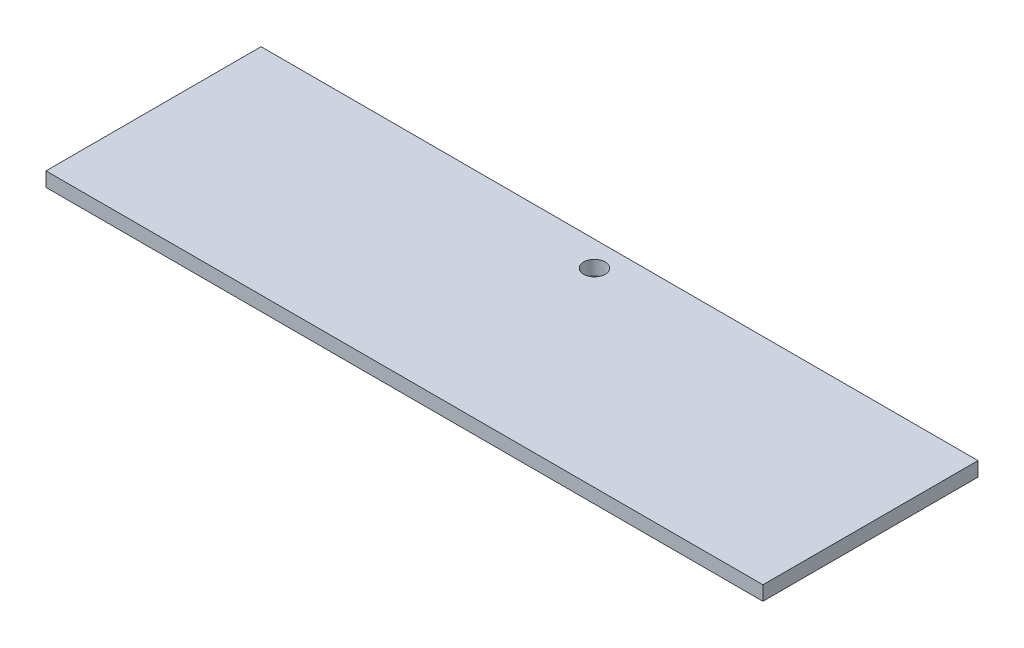
ISO-10303-21;
HEADER;
FILE_DESCRIPTION(('STEP AP214'),'2;1');
FILE_NAME('part.step','',(''),(''),'','','');
FILE_SCHEMA(('AUTOMOTIVE_DESIGN { 1 0 10303 214 1 1 1 1 }'));
ENDSEC;
DATA;
#1=APPLICATION_CONTEXT('core data for automotive mechanical design processes');
#2=APPLICATION_PROTOCOL_DEFINITION('international standard','automotive_design',2000,#1);
#3=PRODUCT_CONTEXT('',#1,'mechanical');
#4=PRODUCT('Part','Part','',(#3));
#5=PRODUCT_RELATED_PRODUCT_CATEGORY('part','',(#4));
#6=PRODUCT_DEFINITION_FORMATION('','',#4);
#7=PRODUCT_DEFINITION_CONTEXT('part definition',#1,'design');
#8=PRODUCT_DEFINITION('design','',#6,#7);
#9=PRODUCT_DEFINITION_SHAPE('','',#8);
#10=(LENGTH_UNIT() NAMED_UNIT(*) SI_UNIT(.MILLI.,.METRE.));
#11=(NAMED_UNIT(*) PLANE_ANGLE_UNIT() SI_UNIT($,.RADIAN.));
#12=(NAMED_UNIT(*) SI_UNIT($,.STERADIAN.) SOLID_ANGLE_UNIT());
#13=UNCERTAINTY_MEASURE_WITH_UNIT(LENGTH_MEASURE(1.E-05),#10,'distance_accuracy_value','');
#14=(GEOMETRIC_REPRESENTATION_CONTEXT(3) GLOBAL_UNCERTAINTY_ASSIGNED_CONTEXT((#13)) GLOBAL_UNIT_ASSIGNED_CONTEXT((#10,
#11,#12)) REPRESENTATION_CONTEXT('',''));
#15=CARTESIAN_POINT('',(0.,0.,0.));
#16=DIRECTION('',(0.,0.,1.));
#17=DIRECTION('',(1.,0.,0.));
#18=AXIS2_PLACEMENT_3D('',#15,#16,#17);
#19=CARTESIAN_POINT('',(317.5,-12.7,95.25));
#20=DIRECTION('',(1.,0.,0.));
#21=DIRECTION('',(0.,0.,-1.));
#22=AXIS2_PLACEMENT_3D('',#19,#20,#21);
#23=PLANE('',#22);
#24=DIRECTION('',(0.,0.,-1.));
#25=VECTOR('',#24,1.);
#26=CARTESIAN_POINT('',(317.5,0.,95.25));
#27=LINE('',#26,#25);
#28=CARTESIAN_POINT('',(317.5,0.,95.25));
#29=VERTEX_POINT('',#28);
#30=CARTESIAN_POINT('',(317.5,0.,-95.25));
#31=VERTEX_POINT('',#30);
#32=EDGE_CURVE('E98',#29,#31,#27,.T.);
#33=ORIENTED_EDGE('',*,*,#32,.F.);
#34=DIRECTION('',(0.,1.,0.));
#35=VECTOR('',#34,1.);
#36=CARTESIAN_POINT('',(317.5,-12.7,95.25));
#37=LINE('',#36,#35);
#38=CARTESIAN_POINT('',(317.5,-12.7,95.25));
#39=VERTEX_POINT('',#38);
#40=EDGE_CURVE('E11',#39,#29,#37,.T.);
#41=ORIENTED_EDGE('',*,*,#40,.F.);
#42=DIRECTION('',(0.,0.,-1.));
#43=VECTOR('',#42,1.);
#44=CARTESIAN_POINT('',(317.5,-12.7,95.25));
#45=LINE('',#44,#43);
#46=CARTESIAN_POINT('',(317.5,-12.7,-95.25));
#47=VERTEX_POINT('',#46);
#48=EDGE_CURVE('E91',#39,#47,#45,.T.);
#49=ORIENTED_EDGE('',*,*,#48,.T.);
#50=DIRECTION('',(0.,1.,0.));
#51=VECTOR('',#50,1.);
#52=CARTESIAN_POINT('',(317.5,-12.7,-95.25));
#53=LINE('',#52,#51);
#54=EDGE_CURVE('E36',#47,#31,#53,.T.);
#55=ORIENTED_EDGE('',*,*,#54,.T.);
#56=EDGE_LOOP('',(#33,#41,#49,#55));
#57=FACE_BOUND('',#56,.T.);
#58=ADVANCED_FACE('F33',(#57),#23,.T.);
#59=CARTESIAN_POINT('',(-317.5,-12.7,95.25));
#60=DIRECTION('',(0.,0.,1.));
#61=DIRECTION('',(1.,0.,0.));
#62=AXIS2_PLACEMENT_3D('',#59,#60,#61);
#63=PLANE('',#62);
#64=DIRECTION('',(1.,0.,0.));
#65=VECTOR('',#64,1.);
#66=CARTESIAN_POINT('',(-317.5,0.,95.25));
#67=LINE('',#66,#65);
#68=CARTESIAN_POINT('',(-317.5,0.,95.25));
#69=VERTEX_POINT('',#68);
#70=EDGE_CURVE('E93',#69,#29,#67,.T.);
#71=ORIENTED_EDGE('',*,*,#70,.F.);
#72=DIRECTION('',(0.,1.,0.));
#73=VECTOR('',#72,1.);
#74=CARTESIAN_POINT('',(-317.5,-12.7,95.25));
#75=LINE('',#74,#73);
#76=CARTESIAN_POINT('',(-317.5,-12.7,95.25));
#77=VERTEX_POINT('',#76);
#78=EDGE_CURVE('E42',#77,#69,#75,.T.);
#79=ORIENTED_EDGE('',*,*,#78,.F.);
#80=DIRECTION('',(1.,0.,0.));
#81=VECTOR('',#80,1.);
#82=CARTESIAN_POINT('',(-317.5,-12.7,95.25));
#83=LINE('',#82,#81);
#84=EDGE_CURVE('E88',#77,#39,#83,.T.);
#85=ORIENTED_EDGE('',*,*,#84,.T.);
#86=ORIENTED_EDGE('',*,*,#40,.T.);
#87=EDGE_LOOP('',(#71,#79,#85,#86));
#88=FACE_BOUND('',#87,.T.);
#89=ADVANCED_FACE('F109',(#88),#63,.T.);
#90=CARTESIAN_POINT('',(-317.5,-12.7,95.25));
#91=DIRECTION('',(-1.,0.,0.));
#92=DIRECTION('',(0.,0.,1.));
#93=AXIS2_PLACEMENT_3D('',#90,#91,#92);
#94=PLANE('',#93);
#95=DIRECTION('',(0.,0.,1.));
#96=VECTOR('',#95,1.);
#97=CARTESIAN_POINT('',(-317.5,0.,95.25));
#98=LINE('',#97,#96);
#99=CARTESIAN_POINT('',(-317.5,0.,-95.25));
#100=VERTEX_POINT('',#99);
#101=EDGE_CURVE('E83',#100,#69,#98,.T.);
#102=ORIENTED_EDGE('',*,*,#101,.F.);
#103=DIRECTION('',(0.,1.,0.));
#104=VECTOR('',#103,1.);
#105=CARTESIAN_POINT('',(-317.5,-12.7,-95.25));
#106=LINE('',#105,#104);
#107=CARTESIAN_POINT('',(-317.5,-12.7,-95.25));
#108=VERTEX_POINT('',#107);
#109=EDGE_CURVE('E78',#108,#100,#106,.T.);
#110=ORIENTED_EDGE('',*,*,#109,.F.);
#111=DIRECTION('',(0.,0.,1.));
#112=VECTOR('',#111,1.);
#113=CARTESIAN_POINT('',(-317.5,-12.7,95.25));
#114=LINE('',#113,#112);
#115=EDGE_CURVE('E81',#108,#77,#114,.T.);
#116=ORIENTED_EDGE('',*,*,#115,.T.);
#117=ORIENTED_EDGE('',*,*,#78,.T.);
#118=EDGE_LOOP('',(#102,#110,#116,#117));
#119=FACE_BOUND('',#118,.T.);
#120=ADVANCED_FACE('F80',(#119),#94,.T.);
#121=CARTESIAN_POINT('',(-317.5,-12.7,-95.25));
#122=DIRECTION('',(0.,0.,-1.));
#123=DIRECTION('',(-1.,0.,0.));
#124=AXIS2_PLACEMENT_3D('',#121,#122,#123);
#125=PLANE('',#124);
#126=DIRECTION('',(-1.,0.,0.));
#127=VECTOR('',#126,1.);
#128=CARTESIAN_POINT('',(-317.5,0.,-95.25));
#129=LINE('',#128,#127);
#130=EDGE_CURVE('E101',#31,#100,#129,.T.);
#131=ORIENTED_EDGE('',*,*,#130,.F.);
#132=ORIENTED_EDGE('',*,*,#54,.F.);
#133=DIRECTION('',(-1.,0.,0.));
#134=VECTOR('',#133,1.);
#135=CARTESIAN_POINT('',(-317.5,-12.7,-95.25));
#136=LINE('',#135,#134);
#137=EDGE_CURVE('E87',#47,#108,#136,.T.);
#138=ORIENTED_EDGE('',*,*,#137,.T.);
#139=ORIENTED_EDGE('',*,*,#109,.T.);
#140=EDGE_LOOP('',(#131,#132,#138,#139));
#141=FACE_BOUND('',#140,.T.);
#142=ADVANCED_FACE('F90',(#141),#125,.T.);
#143=CARTESIAN_POINT('',(0.,-12.7,0.));
#144=DIRECTION('',(0.,-1.,0.));
#145=DIRECTION('',(0.,0.,-1.));
#146=AXIS2_PLACEMENT_3D('',#143,#144,#145);
#147=PLANE('',#146);
#148=CARTESIAN_POINT('',(0.,-12.7,-73.0250000000001));
#149=DIRECTION('',(0.,1.,0.));
#150=DIRECTION('',(0.,0.,1.));
#151=AXIS2_PLACEMENT_3D('',#148,#149,#150);
#152=CIRCLE('',#151,9.525);
#153=CARTESIAN_POINT('',(0.,-12.7,-63.5000000000001));
#154=VERTEX_POINT('',#153);
#155=EDGE_CURVE('E102',#154,#154,#152,.T.);
#156=ORIENTED_EDGE('',*,*,#155,.T.);
#157=EDGE_LOOP('',(#156));
#158=FACE_BOUND('',#157,.T.);
#159=ORIENTED_EDGE('',*,*,#48,.F.);
#160=ORIENTED_EDGE('',*,*,#84,.F.);
#161=ORIENTED_EDGE('',*,*,#115,.F.);
#162=ORIENTED_EDGE('',*,*,#137,.F.);
#163=EDGE_LOOP('',(#159,#160,#161,#162));
#164=FACE_BOUND('',#163,.T.);
#165=ADVANCED_FACE('F86',(#158,#164),#147,.T.);
#166=CARTESIAN_POINT('',(0.,0.,0.));
#167=DIRECTION('',(0.,-1.,0.));
#168=DIRECTION('',(0.,0.,-1.));
#169=AXIS2_PLACEMENT_3D('',#166,#167,#168);
#170=PLANE('',#169);
#171=CARTESIAN_POINT('',(0.,0.,-73.0250000000001));
#172=DIRECTION('',(0.,1.,0.));
#173=DIRECTION('',(0.,0.,1.));
#174=AXIS2_PLACEMENT_3D('',#171,#172,#173);
#175=CIRCLE('',#174,9.525);
#176=CARTESIAN_POINT('',(0.,0.,-63.5000000000001));
#177=VERTEX_POINT('',#176);
#178=EDGE_CURVE('E139',#177,#177,#175,.T.);
#179=ORIENTED_EDGE('',*,*,#178,.F.);
#180=EDGE_LOOP('',(#179));
#181=FACE_BOUND('',#180,.T.);
#182=ORIENTED_EDGE('',*,*,#32,.T.);
#183=ORIENTED_EDGE('',*,*,#130,.T.);
#184=ORIENTED_EDGE('',*,*,#101,.T.);
#185=ORIENTED_EDGE('',*,*,#70,.T.);
#186=EDGE_LOOP('',(#182,#183,#184,#185));
#187=FACE_BOUND('',#186,.T.);
#188=ADVANCED_FACE('F108',(#181,#187),#170,.F.);
#189=CARTESIAN_POINT('',(0.,-12.7,-73.0250000000001));
#190=DIRECTION('',(0.,1.,0.));
#191=DIRECTION('',(0.,0.,1.));
#192=AXIS2_PLACEMENT_3D('',#189,#190,#191);
#193=CYLINDRICAL_SURFACE('',#192,9.525);
#194=ORIENTED_EDGE('',*,*,#155,.F.);
#195=EDGE_LOOP('',(#194));
#196=FACE_BOUND('',#195,.T.);
#197=ORIENTED_EDGE('',*,*,#178,.T.);
#198=EDGE_LOOP('',(#197));
#199=FACE_BOUND('',#198,.T.);
#200=ADVANCED_FACE('F127',(#196,#199),#193,.F.);
#201=CLOSED_SHELL('',(#58,#89,#120,#142,#165,#188,#200));
#202=MANIFOLD_SOLID_BREP('B2',#201);
#203=ADVANCED_BREP_SHAPE_REPRESENTATION('',(#18,#202),#14);
#204=SHAPE_DEFINITION_REPRESENTATION(#9,#203);
ENDSEC;
END-ISO-10303-21;
